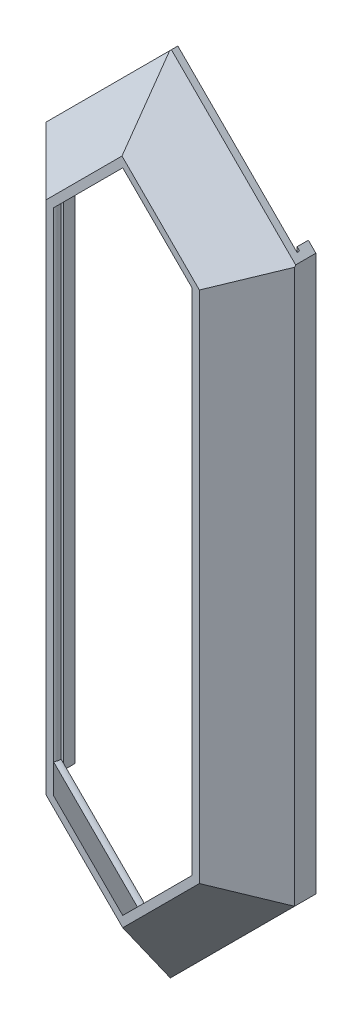
ISO-10303-21;
HEADER;
FILE_DESCRIPTION(('STEP AP214'),'2;1');
FILE_NAME('part.step','',(''),(''),'','','');
FILE_SCHEMA(('AUTOMOTIVE_DESIGN { 1 0 10303 214 1 1 1 1 }'));
ENDSEC;
DATA;
#1=APPLICATION_CONTEXT('core data for automotive mechanical design processes');
#2=APPLICATION_PROTOCOL_DEFINITION('international standard','automotive_design',2000,#1);
#3=PRODUCT_CONTEXT('',#1,'mechanical');
#4=PRODUCT('Part','Part','',(#3));
#5=PRODUCT_RELATED_PRODUCT_CATEGORY('part','',(#4));
#6=PRODUCT_DEFINITION_FORMATION('','',#4);
#7=PRODUCT_DEFINITION_CONTEXT('part definition',#1,'design');
#8=PRODUCT_DEFINITION('design','',#6,#7);
#9=PRODUCT_DEFINITION_SHAPE('','',#8);
#10=(LENGTH_UNIT() NAMED_UNIT(*) SI_UNIT(.MILLI.,.METRE.));
#11=(NAMED_UNIT(*) PLANE_ANGLE_UNIT() SI_UNIT($,.RADIAN.));
#12=(NAMED_UNIT(*) SI_UNIT($,.STERADIAN.) SOLID_ANGLE_UNIT());
#13=UNCERTAINTY_MEASURE_WITH_UNIT(LENGTH_MEASURE(1.E-05),#10,'distance_accuracy_value','');
#14=(GEOMETRIC_REPRESENTATION_CONTEXT(3) GLOBAL_UNCERTAINTY_ASSIGNED_CONTEXT((#13)) GLOBAL_UNIT_ASSIGNED_CONTEXT((#10,
#11,#12)) REPRESENTATION_CONTEXT('',''));
#15=CARTESIAN_POINT('',(0.,0.,0.));
#16=DIRECTION('',(0.,0.,1.));
#17=DIRECTION('',(1.,0.,0.));
#18=AXIS2_PLACEMENT_3D('',#15,#16,#17);
#19=CARTESIAN_POINT('',(0.,0.,-3.));
#20=DIRECTION('',(0.,0.,-1.));
#21=DIRECTION('',(-1.,0.,0.));
#22=AXIS2_PLACEMENT_3D('',#19,#20,#21);
#23=PLANE('',#22);
#24=DIRECTION('',(0.,1.,0.));
#25=VECTOR('',#24,1.);
#26=CARTESIAN_POINT('',(-18.6343452122827,0.,-3.));
#27=LINE('',#26,#25);
#28=CARTESIAN_POINT('',(-18.6343452122827,-45.7,-3.));
#29=VERTEX_POINT('',#28);
#30=CARTESIAN_POINT('',(-18.6343452122827,45.3,-3.));
#31=VERTEX_POINT('',#30);
#32=EDGE_CURVE('E258',#29,#31,#27,.T.);
#33=ORIENTED_EDGE('',*,*,#32,.F.);
#34=DIRECTION('',(-0.707106781186548,0.707106781186547,0.));
#35=VECTOR('',#34,1.);
#36=CARTESIAN_POINT('',(-19.8343452122827,-44.5,-3.));
#37=LINE('',#36,#35);
#38=CARTESIAN_POINT('',(-19.8343452122827,-44.5,-3.));
#39=VERTEX_POINT('',#38);
#40=EDGE_CURVE('E257',#29,#39,#37,.T.);
#41=ORIENTED_EDGE('',*,*,#40,.T.);
#42=DIRECTION('',(0.,1.,0.));
#43=VECTOR('',#42,1.);
#44=CARTESIAN_POINT('',(-19.8343452122827,44.1,-3.));
#45=LINE('',#44,#43);
#46=CARTESIAN_POINT('',(-19.8343452122827,44.1,-3.));
#47=VERTEX_POINT('',#46);
#48=EDGE_CURVE('E278',#39,#47,#45,.T.);
#49=ORIENTED_EDGE('',*,*,#48,.T.);
#50=DIRECTION('',(0.707106781186548,0.707106781186547,0.));
#51=VECTOR('',#50,1.);
#52=CARTESIAN_POINT('',(0.,63.9343452122827,-3.));
#53=LINE('',#52,#51);
#54=EDGE_CURVE('E274',#47,#31,#53,.T.);
#55=ORIENTED_EDGE('',*,*,#54,.T.);
#56=EDGE_LOOP('',(#33,#41,#49,#55));
#57=FACE_BOUND('',#56,.T.);
#58=ADVANCED_FACE('F69',(#57),#23,.T.);
#59=CARTESIAN_POINT('',(-19.2656547877174,43.6029437251523,-1.2));
#60=DIRECTION('',(0.,0.,1.));
#61=DIRECTION('',(0.,-1.,0.));
#62=AXIS2_PLACEMENT_3D('',#59,#60,#61);
#63=PLANE('',#62);
#64=DIRECTION('',(0.,-1.,0.));
#65=VECTOR('',#64,1.);
#66=CARTESIAN_POINT('',(-18.6343452122827,0.,-1.19999999999999));
#67=LINE('',#66,#65);
#68=CARTESIAN_POINT('',(-18.6343452122827,45.3,-1.2));
#69=VERTEX_POINT('',#68);
#70=CARTESIAN_POINT('',(-18.6343452122827,-45.7,-1.2));
#71=VERTEX_POINT('',#70);
#72=EDGE_CURVE('E84',#69,#71,#67,.T.);
#73=ORIENTED_EDGE('',*,*,#72,.F.);
#74=DIRECTION('',(-0.707106781186548,-0.707106781186547,0.));
#75=VECTOR('',#74,1.);
#76=CARTESIAN_POINT('',(-19.8343452122827,44.1,-1.2));
#77=LINE('',#76,#75);
#78=CARTESIAN_POINT('',(-19.2656547877173,44.6686904245654,-1.2));
#79=VERTEX_POINT('',#78);
#80=EDGE_CURVE('E527',#69,#79,#77,.T.);
#81=ORIENTED_EDGE('',*,*,#80,.T.);
#82=DIRECTION('',(0.,-1.,0.));
#83=VECTOR('',#82,1.);
#84=CARTESIAN_POINT('',(-19.2656547877174,43.6029437251523,-1.2));
#85=LINE('',#84,#83);
#86=CARTESIAN_POINT('',(-19.2656547877173,-45.0686904245653,-1.19999999999999));
#87=VERTEX_POINT('',#86);
#88=EDGE_CURVE('E541',#79,#87,#85,.T.);
#89=ORIENTED_EDGE('',*,*,#88,.T.);
#90=DIRECTION('',(-0.707106781186548,0.707106781186547,0.));
#91=VECTOR('',#90,1.);
#92=CARTESIAN_POINT('',(0.,-64.3343452122827,-1.19999999999999));
#93=LINE('',#92,#91);
#94=EDGE_CURVE('E510',#71,#87,#93,.T.);
#95=ORIENTED_EDGE('',*,*,#94,.F.);
#96=EDGE_LOOP('',(#73,#81,#89,#95));
#97=FACE_BOUND('',#96,.T.);
#98=ADVANCED_FACE('F594',(#97),#63,.T.);
#99=CARTESIAN_POINT('',(0.,63.9343452122827,8.));
#100=DIRECTION('',(-0.707106781186547,-0.707106781186547,0.));
#101=DIRECTION('',(0.707106781186548,-0.707106781186548,0.));
#102=AXIS2_PLACEMENT_3D('',#99,#100,#101);
#103=PLANE('',#102);
#104=DIRECTION('',(0.707106781186548,-0.707106781186548,0.));
#105=VECTOR('',#104,1.);
#106=CARTESIAN_POINT('',(19.8343452122826,44.1,-3.));
#107=LINE('',#106,#105);
#108=CARTESIAN_POINT('',(18.6343452122826,45.3,-3.));
#109=VERTEX_POINT('',#108);
#110=CARTESIAN_POINT('',(19.8343452122826,44.1,-3.));
#111=VERTEX_POINT('',#110);
#112=EDGE_CURVE('E251',#109,#111,#107,.T.);
#113=ORIENTED_EDGE('',*,*,#112,.F.);
#114=DIRECTION('',(0.,0.,1.));
#115=VECTOR('',#114,1.);
#116=CARTESIAN_POINT('',(18.6343452122826,45.3,8.));
#117=LINE('',#116,#115);
#118=CARTESIAN_POINT('',(18.6343452122826,45.3,-1.2));
#119=VERTEX_POINT('',#118);
#120=EDGE_CURVE('E261',#109,#119,#117,.T.);
#121=ORIENTED_EDGE('',*,*,#120,.T.);
#122=DIRECTION('',(-0.707106781186548,0.707106781186548,0.));
#123=VECTOR('',#122,1.);
#124=CARTESIAN_POINT('',(0.,63.9343452122827,-1.2));
#125=LINE('',#124,#123);
#126=CARTESIAN_POINT('',(19.0343452122826,44.9,-1.2));
#127=VERTEX_POINT('',#126);
#128=EDGE_CURVE('E529',#127,#119,#125,.T.);
#129=ORIENTED_EDGE('',*,*,#128,.F.);
#130=DIRECTION('',(0.,0.,-1.));
#131=VECTOR('',#130,1.);
#132=CARTESIAN_POINT('',(19.0343452122826,44.9,8.));
#133=LINE('',#132,#131);
#134=CARTESIAN_POINT('',(19.0343452122826,44.9,-0.800000000000001));
#135=VERTEX_POINT('',#134);
#136=EDGE_CURVE('E534',#135,#127,#133,.T.);
#137=ORIENTED_EDGE('',*,*,#136,.F.);
#138=DIRECTION('',(-0.707106781186548,0.707106781186548,0.));
#139=VECTOR('',#138,1.);
#140=CARTESIAN_POINT('',(0.,63.9343452122827,-0.800000000000004));
#141=LINE('',#140,#139);
#142=CARTESIAN_POINT('',(0.,63.9343452122827,-0.800000000000003));
#143=VERTEX_POINT('',#142);
#144=EDGE_CURVE('E524',#135,#143,#141,.T.);
#145=ORIENTED_EDGE('',*,*,#144,.T.);
#146=DIRECTION('',(0.,0.,-1.));
#147=VECTOR('',#146,1.);
#148=CARTESIAN_POINT('',(0.,63.9343452122827,8.));
#149=LINE('',#148,#147);
#150=CARTESIAN_POINT('',(0.,63.9343452122827,0.230175068307269));
#151=VERTEX_POINT('',#150);
#152=EDGE_CURVE('E381',#151,#143,#149,.T.);
#153=ORIENTED_EDGE('',*,*,#152,.F.);
#154=DIRECTION('',(0.707106781186547,-0.707106781186547,0.));
#155=VECTOR('',#154,1.);
#156=CARTESIAN_POINT('',(0.,63.9343452122827,0.23017506830727));
#157=LINE('',#156,#155);
#158=CARTESIAN_POINT('',(19.8343452122826,44.1,0.23017506830727));
#159=VERTEX_POINT('',#158);
#160=EDGE_CURVE('E322',#159,#151,#157,.F.);
#161=ORIENTED_EDGE('',*,*,#160,.F.);
#162=DIRECTION('',(0.,0.,-1.));
#163=VECTOR('',#162,1.);
#164=CARTESIAN_POINT('',(19.8343452122826,44.1,8.));
#165=LINE('',#164,#163);
#166=EDGE_CURVE('E271',#159,#111,#165,.T.);
#167=ORIENTED_EDGE('',*,*,#166,.T.);
#168=EDGE_LOOP('',(#113,#121,#129,#137,#145,#153,#161,#167));
#169=FACE_BOUND('',#168,.T.);
#170=ADVANCED_FACE('F268',(#169),#103,.F.);
#171=CARTESIAN_POINT('',(-19.8343452122827,44.1,8.));
#172=DIRECTION('',(0.707106781186547,-0.707106781186548,0.));
#173=DIRECTION('',(0.707106781186548,0.707106781186547,0.));
#174=AXIS2_PLACEMENT_3D('',#171,#172,#173);
#175=PLANE('',#174);
#176=ORIENTED_EDGE('',*,*,#80,.F.);
#177=DIRECTION('',(0.,0.,-1.));
#178=VECTOR('',#177,1.);
#179=CARTESIAN_POINT('',(-18.6343452122827,45.3,8.));
#180=LINE('',#179,#178);
#181=EDGE_CURVE('E512',#69,#31,#180,.T.);
#182=ORIENTED_EDGE('',*,*,#181,.T.);
#183=ORIENTED_EDGE('',*,*,#54,.F.);
#184=DIRECTION('',(0.,0.,-1.));
#185=VECTOR('',#184,1.);
#186=CARTESIAN_POINT('',(-19.8343452122827,44.1,8.));
#187=LINE('',#186,#185);
#188=CARTESIAN_POINT('',(-19.8343452122827,44.1,0.399999999999987));
#189=VERTEX_POINT('',#188);
#190=EDGE_CURVE('E349',#189,#47,#187,.T.);
#191=ORIENTED_EDGE('',*,*,#190,.F.);
#192=DIRECTION('',(0.707106781186548,0.707106781186547,0.));
#193=VECTOR('',#192,1.);
#194=CARTESIAN_POINT('',(-19.8343452122827,44.1,0.399999999999986));
#195=LINE('',#194,#193);
#196=CARTESIAN_POINT('',(-0.120084360814485,63.8142608514682,0.399999999999998));
#197=VERTEX_POINT('',#196);
#198=EDGE_CURVE('E326',#197,#189,#195,.F.);
#199=ORIENTED_EDGE('',*,*,#198,.F.);
#200=DIRECTION('',(0.500000000000001,0.500000000000001,-0.707106781186546));
#201=VECTOR('',#200,1.);
#202=CARTESIAN_POINT('',(-12.6642205550575,51.2701246572252,18.1400875341536));
#203=LINE('',#202,#201);
#204=EDGE_CURVE('E320',#151,#197,#203,.F.);
#205=ORIENTED_EDGE('',*,*,#204,.F.);
#206=ORIENTED_EDGE('',*,*,#152,.T.);
#207=DIRECTION('',(-0.707106781186548,-0.707106781186547,0.));
#208=VECTOR('',#207,1.);
#209=CARTESIAN_POINT('',(-19.8343452122827,44.1,-0.8));
#210=LINE('',#209,#208);
#211=CARTESIAN_POINT('',(-19.2656547877173,44.6686904245654,-0.8));
#212=VERTEX_POINT('',#211);
#213=EDGE_CURVE('E521',#143,#212,#210,.T.);
#214=ORIENTED_EDGE('',*,*,#213,.T.);
#215=DIRECTION('',(0.,0.,1.));
#216=VECTOR('',#215,1.);
#217=CARTESIAN_POINT('',(-19.2656547877173,44.6686904245654,8.));
#218=LINE('',#217,#216);
#219=EDGE_CURVE('E531',#79,#212,#218,.T.);
#220=ORIENTED_EDGE('',*,*,#219,.F.);
#221=EDGE_LOOP('',(#176,#182,#183,#191,#199,#205,#206,#214,#220));
#222=FACE_BOUND('',#221,.T.);
#223=ADVANCED_FACE('F557',(#222),#175,.F.);
#224=CARTESIAN_POINT('',(-18.6343452122827,0.,-3.));
#225=DIRECTION('',(1.,0.,0.));
#226=DIRECTION('',(0.,1.,0.));
#227=AXIS2_PLACEMENT_3D('',#224,#225,#226);
#228=PLANE('',#227);
#229=ORIENTED_EDGE('',*,*,#32,.T.);
#230=ORIENTED_EDGE('',*,*,#181,.F.);
#231=ORIENTED_EDGE('',*,*,#72,.T.);
#232=DIRECTION('',(0.,0.,1.));
#233=VECTOR('',#232,1.);
#234=CARTESIAN_POINT('',(-18.6343452122827,-45.7,8.));
#235=LINE('',#234,#233);
#236=EDGE_CURVE('E265',#29,#71,#235,.T.);
#237=ORIENTED_EDGE('',*,*,#236,.F.);
#238=EDGE_LOOP('',(#229,#230,#231,#237));
#239=FACE_BOUND('',#238,.T.);
#240=ADVANCED_FACE('F629',(#239),#228,.T.);
#241=CARTESIAN_POINT('',(18.6343452122827,0.,-3.));
#242=DIRECTION('',(-1.,0.,0.));
#243=DIRECTION('',(0.,-1.,0.));
#244=AXIS2_PLACEMENT_3D('',#241,#242,#243);
#245=PLANE('',#244);
#246=DIRECTION('',(0.,-1.,0.));
#247=VECTOR('',#246,1.);
#248=CARTESIAN_POINT('',(18.6343452122827,0.,-3.));
#249=LINE('',#248,#247);
#250=CARTESIAN_POINT('',(18.6343452122826,-45.7,-3.));
#251=VERTEX_POINT('',#250);
#252=EDGE_CURVE('E246',#109,#251,#249,.T.);
#253=ORIENTED_EDGE('',*,*,#252,.T.);
#254=DIRECTION('',(0.,0.,-1.));
#255=VECTOR('',#254,1.);
#256=CARTESIAN_POINT('',(18.6343452122826,-45.7,8.));
#257=LINE('',#256,#255);
#258=CARTESIAN_POINT('',(18.6343452122826,-45.7,-1.19999999999999));
#259=VERTEX_POINT('',#258);
#260=EDGE_CURVE('E266',#259,#251,#257,.T.);
#261=ORIENTED_EDGE('',*,*,#260,.F.);
#262=DIRECTION('',(0.,1.,0.));
#263=VECTOR('',#262,1.);
#264=CARTESIAN_POINT('',(18.6343452122827,0.,-1.19999999999999));
#265=LINE('',#264,#263);
#266=EDGE_CURVE('E13',#259,#119,#265,.T.);
#267=ORIENTED_EDGE('',*,*,#266,.T.);
#268=ORIENTED_EDGE('',*,*,#120,.F.);
#269=EDGE_LOOP('',(#253,#261,#267,#268));
#270=FACE_BOUND('',#269,.T.);
#271=ADVANCED_FACE('F262',(#270),#245,.T.);
#272=CARTESIAN_POINT('',(-19.8343452122827,-44.5,8.));
#273=DIRECTION('',(1.,0.,0.));
#274=DIRECTION('',(0.,1.,0.));
#275=AXIS2_PLACEMENT_3D('',#272,#273,#274);
#276=PLANE('',#275);
#277=DIRECTION('',(0.,1.,0.));
#278=VECTOR('',#277,1.);
#279=CARTESIAN_POINT('',(-19.8343452122827,-44.5,0.400000000000028));
#280=LINE('',#279,#278);
#281=CARTESIAN_POINT('',(-19.8343452122827,-44.5,0.399999999999991));
#282=VERTEX_POINT('',#281);
#283=EDGE_CURVE('E328',#189,#282,#280,.F.);
#284=ORIENTED_EDGE('',*,*,#283,.F.);
#285=ORIENTED_EDGE('',*,*,#190,.T.);
#286=ORIENTED_EDGE('',*,*,#48,.F.);
#287=DIRECTION('',(0.,0.,-1.));
#288=VECTOR('',#287,1.);
#289=CARTESIAN_POINT('',(-19.8343452122827,-44.5,8.));
#290=LINE('',#289,#288);
#291=EDGE_CURVE('E390',#282,#39,#290,.T.);
#292=ORIENTED_EDGE('',*,*,#291,.F.);
#293=EDGE_LOOP('',(#284,#285,#286,#292));
#294=FACE_BOUND('',#293,.T.);
#295=ADVANCED_FACE('F637',(#294),#276,.F.);
#296=CARTESIAN_POINT('',(0.,-64.3343452122827,8.));
#297=DIRECTION('',(0.707106781186547,0.707106781186548,0.));
#298=DIRECTION('',(-0.707106781186548,0.707106781186547,0.));
#299=AXIS2_PLACEMENT_3D('',#296,#297,#298);
#300=PLANE('',#299);
#301=ORIENTED_EDGE('',*,*,#40,.F.);
#302=ORIENTED_EDGE('',*,*,#236,.T.);
#303=ORIENTED_EDGE('',*,*,#94,.T.);
#304=DIRECTION('',(0.,0.,-1.));
#305=VECTOR('',#304,1.);
#306=CARTESIAN_POINT('',(-19.2656547877173,-45.0686904245653,8.));
#307=LINE('',#306,#305);
#308=CARTESIAN_POINT('',(-19.2656547877173,-45.0686904245653,-0.799999999999989));
#309=VERTEX_POINT('',#308);
#310=EDGE_CURVE('E505',#309,#87,#307,.T.);
#311=ORIENTED_EDGE('',*,*,#310,.F.);
#312=DIRECTION('',(-0.707106781186548,0.707106781186547,0.));
#313=VECTOR('',#312,1.);
#314=CARTESIAN_POINT('',(0.,-64.3343452122827,-0.799999999999986));
#315=LINE('',#314,#313);
#316=CARTESIAN_POINT('',(0.,-64.3343452122827,-0.799999999999988));
#317=VERTEX_POINT('',#316);
#318=EDGE_CURVE('E503',#317,#309,#315,.T.);
#319=ORIENTED_EDGE('',*,*,#318,.F.);
#320=DIRECTION('',(0.,0.,-1.));
#321=VECTOR('',#320,1.);
#322=CARTESIAN_POINT('',(0.,-64.3343452122827,8.));
#323=LINE('',#322,#321);
#324=CARTESIAN_POINT('',(0.,-64.3343452122827,0.399999999999996));
#325=VERTEX_POINT('',#324);
#326=EDGE_CURVE('E387',#325,#317,#323,.T.);
#327=ORIENTED_EDGE('',*,*,#326,.F.);
#328=DIRECTION('',(-0.707106781186548,0.707106781186547,0.));
#329=VECTOR('',#328,1.);
#330=CARTESIAN_POINT('',(0.,-64.3343452122827,0.399999999999996));
#331=LINE('',#330,#329);
#332=EDGE_CURVE('E306',#282,#325,#331,.F.);
#333=ORIENTED_EDGE('',*,*,#332,.F.);
#334=ORIENTED_EDGE('',*,*,#291,.T.);
#335=EDGE_LOOP('',(#301,#302,#303,#311,#319,#327,#333,#334));
#336=FACE_BOUND('',#335,.T.);
#337=ADVANCED_FACE('F499',(#336),#300,.F.);
#338=CARTESIAN_POINT('',(19.8343452122827,-44.5,8.));
#339=DIRECTION('',(-0.707106781186547,0.707106781186548,0.));
#340=DIRECTION('',(-0.707106781186548,-0.707106781186547,0.));
#341=AXIS2_PLACEMENT_3D('',#338,#339,#340);
#342=PLANE('',#341);
#343=DIRECTION('',(-0.707106781186548,-0.707106781186547,0.));
#344=VECTOR('',#343,1.);
#345=CARTESIAN_POINT('',(19.8343452122827,-44.5,-1.19999999999999));
#346=LINE('',#345,#344);
#347=CARTESIAN_POINT('',(19.0343452122827,-45.3,-1.19999999999999));
#348=VERTEX_POINT('',#347);
#349=EDGE_CURVE('E507',#348,#259,#346,.T.);
#350=ORIENTED_EDGE('',*,*,#349,.T.);
#351=ORIENTED_EDGE('',*,*,#260,.T.);
#352=DIRECTION('',(-0.707106781186548,-0.707106781186547,0.));
#353=VECTOR('',#352,1.);
#354=CARTESIAN_POINT('',(0.,-64.3343452122827,-3.));
#355=LINE('',#354,#353);
#356=CARTESIAN_POINT('',(19.8343452122827,-44.5,-3.));
#357=VERTEX_POINT('',#356);
#358=EDGE_CURVE('E254',#357,#251,#355,.T.);
#359=ORIENTED_EDGE('',*,*,#358,.F.);
#360=DIRECTION('',(0.,0.,-1.));
#361=VECTOR('',#360,1.);
#362=CARTESIAN_POINT('',(19.8343452122827,-44.5,8.));
#363=LINE('',#362,#361);
#364=CARTESIAN_POINT('',(19.8343452122827,-44.5,0.399999999999965));
#365=VERTEX_POINT('',#364);
#366=EDGE_CURVE('E385',#365,#357,#363,.T.);
#367=ORIENTED_EDGE('',*,*,#366,.F.);
#368=DIRECTION('',(-0.707106781186548,-0.707106781186547,0.));
#369=VECTOR('',#368,1.);
#370=CARTESIAN_POINT('',(19.8343452122827,-44.5,0.399999999999992));
#371=LINE('',#370,#369);
#372=EDGE_CURVE('E316',#325,#365,#371,.F.);
#373=ORIENTED_EDGE('',*,*,#372,.F.);
#374=ORIENTED_EDGE('',*,*,#326,.T.);
#375=DIRECTION('',(-0.707106781186548,-0.707106781186547,0.));
#376=VECTOR('',#375,1.);
#377=CARTESIAN_POINT('',(19.8343452122827,-44.5,-0.79999999999999));
#378=LINE('',#377,#376);
#379=CARTESIAN_POINT('',(19.0343452122827,-45.3,-0.79999999999999));
#380=VERTEX_POINT('',#379);
#381=EDGE_CURVE('E508',#380,#317,#378,.T.);
#382=ORIENTED_EDGE('',*,*,#381,.F.);
#383=DIRECTION('',(0.,0.,1.));
#384=VECTOR('',#383,1.);
#385=CARTESIAN_POINT('',(19.0343452122827,-45.3,8.));
#386=LINE('',#385,#384);
#387=EDGE_CURVE('E518',#348,#380,#386,.T.);
#388=ORIENTED_EDGE('',*,*,#387,.F.);
#389=EDGE_LOOP('',(#350,#351,#359,#367,#373,#374,#382,#388));
#390=FACE_BOUND('',#389,.T.);
#391=ADVANCED_FACE('F494',(#390),#342,.F.);
#392=CARTESIAN_POINT('',(19.8343452122826,44.1,8.));
#393=DIRECTION('',(-1.,0.,0.));
#394=DIRECTION('',(0.,-1.,0.));
#395=AXIS2_PLACEMENT_3D('',#392,#393,#394);
#396=PLANE('',#395);
#397=DIRECTION('',(0.,-0.816496580927727,0.577350269189624));
#398=VECTOR('',#397,1.);
#399=CARTESIAN_POINT('',(19.8343452122826,40.4372694014452,2.82011671220483));
#400=LINE('',#399,#398);
#401=CARTESIAN_POINT('',(19.8343452122826,43.859831278371,0.400000000000028));
#402=VERTEX_POINT('',#401);
#403=EDGE_CURVE('E324',#402,#159,#400,.F.);
#404=ORIENTED_EDGE('',*,*,#403,.F.);
#405=DIRECTION('',(0.,-1.,0.));
#406=VECTOR('',#405,1.);
#407=CARTESIAN_POINT('',(19.8343452122826,44.1,0.400000000000028));
#408=LINE('',#407,#406);
#409=EDGE_CURVE('E318',#365,#402,#408,.F.);
#410=ORIENTED_EDGE('',*,*,#409,.F.);
#411=ORIENTED_EDGE('',*,*,#366,.T.);
#412=DIRECTION('',(0.,-1.,0.));
#413=VECTOR('',#412,1.);
#414=CARTESIAN_POINT('',(19.8343452122827,-44.5,-3.));
#415=LINE('',#414,#413);
#416=EDGE_CURVE('E273',#111,#357,#415,.T.);
#417=ORIENTED_EDGE('',*,*,#416,.F.);
#418=ORIENTED_EDGE('',*,*,#166,.F.);
#419=EDGE_LOOP('',(#404,#410,#411,#417,#418));
#420=FACE_BOUND('',#419,.T.);
#421=ADVANCED_FACE('F472',(#420),#396,.F.);
#422=CARTESIAN_POINT('',(0.,0.,8.));
#423=DIRECTION('',(0.,0.,-1.));
#424=DIRECTION('',(-1.,0.,0.));
#425=AXIS2_PLACEMENT_3D('',#422,#423,#424);
#426=PLANE('',#425);
#427=DIRECTION('',(0.707106781186548,0.707106781186547,0.));
#428=VECTOR('',#427,1.);
#429=CARTESIAN_POINT('',(5.65685424949238,57.1461201128918,8.));
#430=LINE('',#429,#428);
#431=CARTESIAN_POINT('',(-11.0343452122827,40.4549206511167,8.));
#432=VERTEX_POINT('',#431);
#433=CARTESIAN_POINT('',(0.,51.4892658633994,8.));
#434=VERTEX_POINT('',#433);
#435=EDGE_CURVE('E355',#432,#434,#430,.T.);
#436=ORIENTED_EDGE('',*,*,#435,.T.);
#437=DIRECTION('',(0.707106781186547,-0.707106781186547,0.));
#438=VECTOR('',#437,1.);
#439=CARTESIAN_POINT('',(13.3774909627903,38.1117749006091,8.));
#440=LINE('',#439,#438);
#441=CARTESIAN_POINT('',(11.0343452122826,40.4549206511167,8.));
#442=VERTEX_POINT('',#441);
#443=EDGE_CURVE('E345',#434,#442,#440,.T.);
#444=ORIENTED_EDGE('',*,*,#443,.T.);
#445=DIRECTION('',(0.,-1.,0.));
#446=VECTOR('',#445,1.);
#447=CARTESIAN_POINT('',(11.0343452122826,-44.1686291501015,8.));
#448=LINE('',#447,#446);
#449=CARTESIAN_POINT('',(11.0343452122826,-40.8549206511167,8.));
#450=VERTEX_POINT('',#449);
#451=EDGE_CURVE('E366',#442,#450,#448,.T.);
#452=ORIENTED_EDGE('',*,*,#451,.T.);
#453=DIRECTION('',(-0.707106781186548,-0.707106781186548,0.));
#454=VECTOR('',#453,1.);
#455=CARTESIAN_POINT('',(-5.6568542494924,-57.5461201128918,8.));
#456=LINE('',#455,#454);
#457=CARTESIAN_POINT('',(0.,-51.8892658633994,8.));
#458=VERTEX_POINT('',#457);
#459=EDGE_CURVE('E375',#450,#458,#456,.T.);
#460=ORIENTED_EDGE('',*,*,#459,.T.);
#461=DIRECTION('',(-0.707106781186548,0.707106781186547,0.));
#462=VECTOR('',#461,1.);
#463=CARTESIAN_POINT('',(-13.3774909627903,-38.5117749006091,8.));
#464=LINE('',#463,#462);
#465=CARTESIAN_POINT('',(-11.0343452122827,-40.8549206511167,8.));
#466=VERTEX_POINT('',#465);
#467=EDGE_CURVE('E372',#458,#466,#464,.T.);
#468=ORIENTED_EDGE('',*,*,#467,.T.);
#469=DIRECTION('',(0.,1.,0.));
#470=VECTOR('',#469,1.);
#471=CARTESIAN_POINT('',(-11.0343452122827,43.7686291501015,8.));
#472=LINE('',#471,#470);
#473=EDGE_CURVE('E369',#466,#432,#472,.T.);
#474=ORIENTED_EDGE('',*,*,#473,.T.);
#475=EDGE_LOOP('',(#436,#444,#452,#460,#468,#474));
#476=FACE_BOUND('',#475,.T.);
#477=DIRECTION('',(0.,-1.,0.));
#478=VECTOR('',#477,1.);
#479=CARTESIAN_POINT('',(-12.2343452122827,-41.3519769259644,8.));
#480=LINE('',#479,#478);
#481=CARTESIAN_POINT('',(-12.2343452122827,40.9519769259645,8.));
#482=VERTEX_POINT('',#481);
#483=CARTESIAN_POINT('',(-12.2343452122827,-41.3519769259644,8.));
#484=VERTEX_POINT('',#483);
#485=EDGE_CURVE('E283',#482,#484,#480,.T.);
#486=ORIENTED_EDGE('',*,*,#485,.T.);
#487=DIRECTION('',(0.707106781186548,-0.707106781186548,0.));
#488=VECTOR('',#487,1.);
#489=CARTESIAN_POINT('',(0.,-53.5863221382471,8.));
#490=LINE('',#489,#488);
#491=CARTESIAN_POINT('',(0.,-53.5863221382471,8.));
#492=VERTEX_POINT('',#491);
#493=EDGE_CURVE('E286',#484,#492,#490,.T.);
#494=ORIENTED_EDGE('',*,*,#493,.T.);
#495=DIRECTION('',(0.707106781186548,0.707106781186547,0.));
#496=VECTOR('',#495,1.);
#497=CARTESIAN_POINT('',(12.2343452122826,-41.3519769259645,8.));
#498=LINE('',#497,#496);
#499=CARTESIAN_POINT('',(12.2343452122826,-41.3519769259645,8.));
#500=VERTEX_POINT('',#499);
#501=EDGE_CURVE('E289',#492,#500,#498,.T.);
#502=ORIENTED_EDGE('',*,*,#501,.T.);
#503=DIRECTION('',(0.,1.,0.));
#504=VECTOR('',#503,1.);
#505=CARTESIAN_POINT('',(12.2343452122826,40.7118082043355,8.));
#506=LINE('',#505,#504);
#507=CARTESIAN_POINT('',(12.2343452122826,40.7118082043355,8.));
#508=VERTEX_POINT('',#507);
#509=EDGE_CURVE('E292',#500,#508,#506,.T.);
#510=ORIENTED_EDGE('',*,*,#509,.T.);
#511=DIRECTION('',(-0.707106781186548,0.707106781186548,0.));
#512=VECTOR('',#511,1.);
#513=CARTESIAN_POINT('',(-0.120084360814488,53.0662377774326,8.));
#514=LINE('',#513,#512);
#515=CARTESIAN_POINT('',(-0.120084360814488,53.0662377774326,8.));
#516=VERTEX_POINT('',#515);
#517=EDGE_CURVE('E295',#508,#516,#514,.T.);
#518=ORIENTED_EDGE('',*,*,#517,.T.);
#519=DIRECTION('',(-0.707106781186548,-0.707106781186547,0.));
#520=VECTOR('',#519,1.);
#521=CARTESIAN_POINT('',(-12.2343452122827,40.9519769259645,8.));
#522=LINE('',#521,#520);
#523=EDGE_CURVE('E298',#516,#482,#522,.T.);
#524=ORIENTED_EDGE('',*,*,#523,.T.);
#525=EDGE_LOOP('',(#486,#494,#502,#510,#518,#524));
#526=FACE_BOUND('',#525,.T.);
#527=ADVANCED_FACE('F469',(#476,#526),#426,.F.);
#528=CARTESIAN_POINT('',(19.0343452122827,43.7686291501015,0.));
#529=DIRECTION('',(0.499999999999999,0.499999999999999,0.707106781186549));
#530=DIRECTION('',(0.816496580927727,0.,-0.577350269189624));
#531=AXIS2_PLACEMENT_3D('',#528,#529,#530);
#532=PLANE('',#531);
#533=DIRECTION('',(0.707106781186547,-0.707106781186547,0.));
#534=VECTOR('',#533,1.);
#535=CARTESIAN_POINT('',(19.0343452122827,43.7686291501015,0.));
#536=LINE('',#535,#534);
#537=CARTESIAN_POINT('',(0.,62.8029743623842,0.));
#538=VERTEX_POINT('',#537);
#539=CARTESIAN_POINT('',(19.0343452122827,43.7686291501015,0.));
#540=VERTEX_POINT('',#539);
#541=EDGE_CURVE('E330',#538,#540,#536,.T.);
#542=ORIENTED_EDGE('',*,*,#541,.T.);
#543=DIRECTION('',(0.678598344545848,0.281084637714821,-0.678598344545846));
#544=VECTOR('',#543,1.);
#545=CARTESIAN_POINT('',(19.0343452122827,43.7686291501015,0.));
#546=LINE('',#545,#544);
#547=EDGE_CURVE('E351',#442,#540,#546,.T.);
#548=ORIENTED_EDGE('',*,*,#547,.F.);
#549=ORIENTED_EDGE('',*,*,#443,.F.);
#550=DIRECTION('',(0.,0.816496580927727,-0.577350269189625));
#551=VECTOR('',#550,1.);
#552=CARTESIAN_POINT('',(0.,62.8029743623842,0.));
#553=LINE('',#552,#551);
#554=EDGE_CURVE('E346',#434,#538,#553,.T.);
#555=ORIENTED_EDGE('',*,*,#554,.T.);
#556=EDGE_LOOP('',(#542,#548,#549,#555));
#557=FACE_BOUND('',#556,.T.);
#558=ADVANCED_FACE('F462',(#557),#532,.F.);
#559=CARTESIAN_POINT('',(0.,62.8029743623842,0.));
#560=DIRECTION('',(-0.499999999999999,0.499999999999999,0.707106781186549));
#561=DIRECTION('',(0.,-0.816496580927727,0.577350269189625));
#562=AXIS2_PLACEMENT_3D('',#559,#560,#561);
#563=PLANE('',#562);
#564=DIRECTION('',(0.707106781186548,0.707106781186547,0.));
#565=VECTOR('',#564,1.);
#566=CARTESIAN_POINT('',(0.,62.8029743623842,0.));
#567=LINE('',#566,#565);
#568=CARTESIAN_POINT('',(-19.0343452122827,43.7686291501015,0.));
#569=VERTEX_POINT('',#568);
#570=EDGE_CURVE('E343',#569,#538,#567,.T.);
#571=ORIENTED_EDGE('',*,*,#570,.T.);
#572=ORIENTED_EDGE('',*,*,#554,.F.);
#573=ORIENTED_EDGE('',*,*,#435,.F.);
#574=DIRECTION('',(-0.678598344545848,0.281084637714821,-0.678598344545846));
#575=VECTOR('',#574,1.);
#576=CARTESIAN_POINT('',(-19.0343452122827,43.7686291501015,0.));
#577=LINE('',#576,#575);
#578=EDGE_CURVE('E350',#432,#569,#577,.T.);
#579=ORIENTED_EDGE('',*,*,#578,.T.);
#580=EDGE_LOOP('',(#571,#572,#573,#579));
#581=FACE_BOUND('',#580,.T.);
#582=ADVANCED_FACE('F465',(#581),#563,.F.);
#583=CARTESIAN_POINT('',(-19.0343452122827,43.7686291501015,0.));
#584=DIRECTION('',(-0.707106781186546,0.,0.707106781186549));
#585=DIRECTION('',(0.707106781186549,0.,0.707106781186546));
#586=AXIS2_PLACEMENT_3D('',#583,#584,#585);
#587=PLANE('',#586);
#588=DIRECTION('',(-0.678598344545848,-0.281084637714821,-0.678598344545846));
#589=VECTOR('',#588,1.);
#590=CARTESIAN_POINT('',(-19.0343452122827,-44.1686291501015,0.));
#591=LINE('',#590,#589);
#592=CARTESIAN_POINT('',(-19.0343452122827,-44.1686291501015,0.));
#593=VERTEX_POINT('',#592);
#594=EDGE_CURVE('E359',#466,#593,#591,.T.);
#595=ORIENTED_EDGE('',*,*,#594,.T.);
#596=DIRECTION('',(0.,1.,0.));
#597=VECTOR('',#596,1.);
#598=CARTESIAN_POINT('',(-19.0343452122827,43.7686291501015,0.));
#599=LINE('',#598,#597);
#600=EDGE_CURVE('E341',#593,#569,#599,.T.);
#601=ORIENTED_EDGE('',*,*,#600,.T.);
#602=ORIENTED_EDGE('',*,*,#578,.F.);
#603=ORIENTED_EDGE('',*,*,#473,.F.);
#604=EDGE_LOOP('',(#595,#601,#602,#603));
#605=FACE_BOUND('',#604,.T.);
#606=ADVANCED_FACE('F467',(#605),#587,.F.);
#607=CARTESIAN_POINT('',(-19.0343452122827,-44.1686291501015,0.));
#608=DIRECTION('',(-0.499999999999999,-0.499999999999999,0.707106781186549));
#609=DIRECTION('',(0.,-0.816496580927727,-0.577350269189625));
#610=AXIS2_PLACEMENT_3D('',#607,#608,#609);
#611=PLANE('',#610);
#612=DIRECTION('',(-0.707106781186548,0.707106781186547,0.));
#613=VECTOR('',#612,1.);
#614=CARTESIAN_POINT('',(-19.0343452122827,-44.1686291501015,0.));
#615=LINE('',#614,#613);
#616=CARTESIAN_POINT('',(0.,-63.2029743623842,0.));
#617=VERTEX_POINT('',#616);
#618=EDGE_CURVE('E338',#617,#593,#615,.T.);
#619=ORIENTED_EDGE('',*,*,#618,.T.);
#620=ORIENTED_EDGE('',*,*,#594,.F.);
#621=ORIENTED_EDGE('',*,*,#467,.F.);
#622=DIRECTION('',(0.,-0.816496580927727,-0.577350269189625));
#623=VECTOR('',#622,1.);
#624=CARTESIAN_POINT('',(0.,-63.2029743623842,0.));
#625=LINE('',#624,#623);
#626=EDGE_CURVE('E357',#458,#617,#625,.T.);
#627=ORIENTED_EDGE('',*,*,#626,.T.);
#628=EDGE_LOOP('',(#619,#620,#621,#627));
#629=FACE_BOUND('',#628,.T.);
#630=ADVANCED_FACE('F451',(#629),#611,.F.);
#631=CARTESIAN_POINT('',(0.,-63.2029743623842,0.));
#632=DIRECTION('',(0.499999999999999,-0.499999999999999,0.707106781186549));
#633=DIRECTION('',(0.816496580927727,0.,-0.577350269189624));
#634=AXIS2_PLACEMENT_3D('',#631,#632,#633);
#635=PLANE('',#634);
#636=DIRECTION('',(-0.707106781186548,-0.707106781186548,0.));
#637=VECTOR('',#636,1.);
#638=CARTESIAN_POINT('',(0.,-63.2029743623842,0.));
#639=LINE('',#638,#637);
#640=CARTESIAN_POINT('',(19.0343452122827,-44.1686291501015,0.));
#641=VERTEX_POINT('',#640);
#642=EDGE_CURVE('E335',#641,#617,#639,.T.);
#643=ORIENTED_EDGE('',*,*,#642,.T.);
#644=ORIENTED_EDGE('',*,*,#626,.F.);
#645=ORIENTED_EDGE('',*,*,#459,.F.);
#646=DIRECTION('',(0.678598344545848,-0.281084637714821,-0.678598344545846));
#647=VECTOR('',#646,1.);
#648=CARTESIAN_POINT('',(19.0343452122827,-44.1686291501015,0.));
#649=LINE('',#648,#647);
#650=EDGE_CURVE('E354',#450,#641,#649,.T.);
#651=ORIENTED_EDGE('',*,*,#650,.T.);
#652=EDGE_LOOP('',(#643,#644,#645,#651));
#653=FACE_BOUND('',#652,.T.);
#654=ADVANCED_FACE('F455',(#653),#635,.F.);
#655=CARTESIAN_POINT('',(19.0343452122827,-44.1686291501015,0.));
#656=DIRECTION('',(0.707106781186546,0.,0.707106781186549));
#657=DIRECTION('',(0.707106781186549,0.,-0.707106781186546));
#658=AXIS2_PLACEMENT_3D('',#655,#656,#657);
#659=PLANE('',#658);
#660=DIRECTION('',(0.,-1.,0.));
#661=VECTOR('',#660,1.);
#662=CARTESIAN_POINT('',(19.0343452122827,-44.1686291501015,0.));
#663=LINE('',#662,#661);
#664=EDGE_CURVE('E332',#540,#641,#663,.T.);
#665=ORIENTED_EDGE('',*,*,#664,.T.);
#666=ORIENTED_EDGE('',*,*,#650,.F.);
#667=ORIENTED_EDGE('',*,*,#451,.F.);
#668=ORIENTED_EDGE('',*,*,#547,.T.);
#669=EDGE_LOOP('',(#665,#666,#667,#668));
#670=FACE_BOUND('',#669,.T.);
#671=ADVANCED_FACE('F459',(#670),#659,.F.);
#672=CARTESIAN_POINT('',(-12.2343452122827,-41.3519769259644,8.));
#673=DIRECTION('',(0.707106781186546,0.,-0.707106781186549));
#674=DIRECTION('',(-0.707106781186549,0.,-0.707106781186546));
#675=AXIS2_PLACEMENT_3D('',#672,#673,#674);
#676=PLANE('',#675);
#677=ORIENTED_EDGE('',*,*,#283,.T.);
#678=DIRECTION('',(0.678598344545848,0.281084637714821,0.678598344545846));
#679=VECTOR('',#678,1.);
#680=CARTESIAN_POINT('',(-12.2343452122827,-41.3519769259644,8.));
#681=LINE('',#680,#679);
#682=EDGE_CURVE('E301',#282,#484,#681,.T.);
#683=ORIENTED_EDGE('',*,*,#682,.T.);
#684=ORIENTED_EDGE('',*,*,#485,.F.);
#685=DIRECTION('',(0.678598344545848,-0.281084637714821,0.678598344545846));
#686=VECTOR('',#685,1.);
#687=CARTESIAN_POINT('',(-12.2343452122827,40.9519769259645,8.));
#688=LINE('',#687,#686);
#689=EDGE_CURVE('E304',#189,#482,#688,.T.);
#690=ORIENTED_EDGE('',*,*,#689,.F.);
#691=EDGE_LOOP('',(#677,#683,#684,#690));
#692=FACE_BOUND('',#691,.T.);
#693=ADVANCED_FACE('F479',(#692),#676,.F.);
#694=CARTESIAN_POINT('',(-12.2343452122827,40.9519769259645,8.));
#695=DIRECTION('',(0.499999999999999,-0.499999999999999,-0.707106781186549));
#696=DIRECTION('',(0.,0.816496580927727,-0.577350269189625));
#697=AXIS2_PLACEMENT_3D('',#694,#695,#696);
#698=PLANE('',#697);
#699=ORIENTED_EDGE('',*,*,#198,.T.);
#700=ORIENTED_EDGE('',*,*,#689,.T.);
#701=ORIENTED_EDGE('',*,*,#523,.F.);
#702=DIRECTION('',(0.,-0.816496580927727,0.577350269189625));
#703=VECTOR('',#702,1.);
#704=CARTESIAN_POINT('',(-0.120084360814487,53.0662377774326,8.));
#705=LINE('',#704,#703);
#706=EDGE_CURVE('E307',#197,#516,#705,.T.);
#707=ORIENTED_EDGE('',*,*,#706,.F.);
#708=EDGE_LOOP('',(#699,#700,#701,#707));
#709=FACE_BOUND('',#708,.T.);
#710=ADVANCED_FACE('F577',(#709),#698,.F.);
#711=CARTESIAN_POINT('',(-0.120084360814488,53.0662377774326,8.));
#712=DIRECTION('',(-0.499999999999999,-0.499999999999999,-0.707106781186549));
#713=DIRECTION('',(-0.816496580927727,0.,0.577350269189624));
#714=AXIS2_PLACEMENT_3D('',#711,#712,#713);
#715=PLANE('',#714);
#716=ORIENTED_EDGE('',*,*,#403,.T.);
#717=ORIENTED_EDGE('',*,*,#160,.T.);
#718=ORIENTED_EDGE('',*,*,#204,.T.);
#719=ORIENTED_EDGE('',*,*,#706,.T.);
#720=ORIENTED_EDGE('',*,*,#517,.F.);
#721=DIRECTION('',(-0.678598344545848,-0.281084637714821,0.678598344545846));
#722=VECTOR('',#721,1.);
#723=CARTESIAN_POINT('',(12.2343452122826,40.7118082043355,8.));
#724=LINE('',#723,#722);
#725=EDGE_CURVE('E309',#402,#508,#724,.T.);
#726=ORIENTED_EDGE('',*,*,#725,.F.);
#727=EDGE_LOOP('',(#716,#717,#718,#719,#720,#726));
#728=FACE_BOUND('',#727,.T.);
#729=ADVANCED_FACE('F574',(#728),#715,.F.);
#730=CARTESIAN_POINT('',(12.2343452122826,40.7118082043355,8.));
#731=DIRECTION('',(-0.707106781186546,0.,-0.707106781186549));
#732=DIRECTION('',(-0.707106781186549,0.,0.707106781186546));
#733=AXIS2_PLACEMENT_3D('',#730,#731,#732);
#734=PLANE('',#733);
#735=ORIENTED_EDGE('',*,*,#409,.T.);
#736=ORIENTED_EDGE('',*,*,#725,.T.);
#737=ORIENTED_EDGE('',*,*,#509,.F.);
#738=DIRECTION('',(-0.678598344545848,0.281084637714821,0.678598344545846));
#739=VECTOR('',#738,1.);
#740=CARTESIAN_POINT('',(12.2343452122826,-41.3519769259645,8.));
#741=LINE('',#740,#739);
#742=EDGE_CURVE('E311',#365,#500,#741,.T.);
#743=ORIENTED_EDGE('',*,*,#742,.F.);
#744=EDGE_LOOP('',(#735,#736,#737,#743));
#745=FACE_BOUND('',#744,.T.);
#746=ADVANCED_FACE('F584',(#745),#734,.F.);
#747=CARTESIAN_POINT('',(12.2343452122826,-41.3519769259645,8.));
#748=DIRECTION('',(-0.499999999999999,0.499999999999999,-0.707106781186549));
#749=DIRECTION('',(0.,0.816496580927727,0.577350269189625));
#750=AXIS2_PLACEMENT_3D('',#747,#748,#749);
#751=PLANE('',#750);
#752=ORIENTED_EDGE('',*,*,#372,.T.);
#753=ORIENTED_EDGE('',*,*,#742,.T.);
#754=ORIENTED_EDGE('',*,*,#501,.F.);
#755=DIRECTION('',(0.,0.816496580927727,0.577350269189625));
#756=VECTOR('',#755,1.);
#757=CARTESIAN_POINT('',(0.,-53.5863221382471,8.));
#758=LINE('',#757,#756);
#759=EDGE_CURVE('E303',#325,#492,#758,.T.);
#760=ORIENTED_EDGE('',*,*,#759,.F.);
#761=EDGE_LOOP('',(#752,#753,#754,#760));
#762=FACE_BOUND('',#761,.T.);
#763=ADVANCED_FACE('F488',(#762),#751,.F.);
#764=CARTESIAN_POINT('',(0.,-53.5863221382471,8.));
#765=DIRECTION('',(0.499999999999999,0.499999999999999,-0.707106781186549));
#766=DIRECTION('',(-0.816496580927727,0.,-0.577350269189624));
#767=AXIS2_PLACEMENT_3D('',#764,#765,#766);
#768=PLANE('',#767);
#769=ORIENTED_EDGE('',*,*,#332,.T.);
#770=ORIENTED_EDGE('',*,*,#759,.T.);
#771=ORIENTED_EDGE('',*,*,#493,.F.);
#772=ORIENTED_EDGE('',*,*,#682,.F.);
#773=EDGE_LOOP('',(#769,#770,#771,#772));
#774=FACE_BOUND('',#773,.T.);
#775=ADVANCED_FACE('F484',(#774),#768,.F.);
#776=ORIENTED_EDGE('',*,*,#252,.F.);
#777=ORIENTED_EDGE('',*,*,#112,.T.);
#778=ORIENTED_EDGE('',*,*,#416,.T.);
#779=ORIENTED_EDGE('',*,*,#358,.T.);
#780=EDGE_LOOP('',(#776,#777,#778,#779));
#781=FACE_BOUND('',#780,.T.);
#782=ADVANCED_FACE('F248',(#781),#23,.T.);
#783=CARTESIAN_POINT('',(-19.6343452122827,0.,-0.800000000000013));
#784=DIRECTION('',(0.,1.,0.));
#785=DIRECTION('',(-1.,0.,0.));
#786=AXIS2_PLACEMENT_3D('',#783,#784,#785);
#787=CYLINDRICAL_SURFACE('',#786,1.);
#788=ORIENTED_EDGE('',*,*,#600,.F.);
#789=CARTESIAN_POINT('',(-19.6343452122827,-44.4171572875254,-0.800000000000004));
#790=DIRECTION('',(-0.38268343236509,0.923879532511287,0.));
#791=DIRECTION('',(-0.923879532511287,-0.38268343236509,0.));
#792=AXIS2_PLACEMENT_3D('',#789,#790,#791);
#793=ELLIPSE('',#792,1.08239220029239,1.);
#794=CARTESIAN_POINT('',(-18.6343452122826,-44.0029437251523,-0.799999999999989));
#795=VERTEX_POINT('',#794);
#796=EDGE_CURVE('E409',#593,#795,#793,.T.);
#797=ORIENTED_EDGE('',*,*,#796,.T.);
#798=DIRECTION('',(0.,-1.,0.));
#799=VECTOR('',#798,1.);
#800=CARTESIAN_POINT('',(-18.6343452122827,-44.0029437251523,-0.800000000000013));
#801=LINE('',#800,#799);
#802=CARTESIAN_POINT('',(-18.6343452122827,43.6029437251523,-0.8));
#803=VERTEX_POINT('',#802);
#804=EDGE_CURVE('E395',#803,#795,#801,.T.);
#805=ORIENTED_EDGE('',*,*,#804,.F.);
#806=CARTESIAN_POINT('',(-19.6343452122827,44.0171572875254,-0.799999999999997));
#807=DIRECTION('',(0.38268343236509,0.923879532511287,0.));
#808=DIRECTION('',(-0.923879532511287,0.38268343236509,0.));
#809=AXIS2_PLACEMENT_3D('',#806,#807,#808);
#810=ELLIPSE('',#809,1.08239220029239,1.);
#811=EDGE_CURVE('E398',#569,#803,#810,.T.);
#812=ORIENTED_EDGE('',*,*,#811,.F.);
#813=EDGE_LOOP('',(#788,#797,#805,#812));
#814=FACE_BOUND('',#813,.T.);
#815=ADVANCED_FACE('F439',(#814),#787,.T.);
#816=CARTESIAN_POINT('',(-31.825751249904,31.8257512499041,-0.799999999999981));
#817=DIRECTION('',(0.707106781186548,0.707106781186547,0.));
#818=DIRECTION('',(-0.707106781186547,0.707106781186548,0.));
#819=AXIS2_PLACEMENT_3D('',#816,#817,#818);
#820=CYLINDRICAL_SURFACE('',#819,1.);
#821=ORIENTED_EDGE('',*,*,#811,.T.);
#822=DIRECTION('',(-0.707106781186548,-0.707106781186547,0.));
#823=VECTOR('',#822,1.);
#824=CARTESIAN_POINT('',(-18.6343452122827,43.6029437251523,-0.799999999999981));
#825=LINE('',#824,#823);
#826=CARTESIAN_POINT('',(0.,62.2372889374349,-0.799999999999999));
#827=VERTEX_POINT('',#826);
#828=EDGE_CURVE('E393',#827,#803,#825,.T.);
#829=ORIENTED_EDGE('',*,*,#828,.F.);
#830=CARTESIAN_POINT('',(0.,63.6515024998081,-0.799999999999992));
#831=DIRECTION('',(1.,0.,0.));
#832=DIRECTION('',(0.,-1.,0.));
#833=AXIS2_PLACEMENT_3D('',#830,#831,#832);
#834=ELLIPSE('',#833,1.41421356237309,1.);
#835=EDGE_CURVE('E77',#827,#538,#834,.F.);
#836=ORIENTED_EDGE('',*,*,#835,.T.);
#837=ORIENTED_EDGE('',*,*,#570,.F.);
#838=EDGE_LOOP('',(#821,#829,#836,#837));
#839=FACE_BOUND('',#838,.T.);
#840=ADVANCED_FACE('F435',(#839),#820,.T.);
#841=CARTESIAN_POINT('',(31.825751249904,31.825751249904,-0.800000000000003));
#842=DIRECTION('',(0.707106781186547,-0.707106781186547,0.));
#843=DIRECTION('',(0.707106781186548,0.707106781186548,0.));
#844=AXIS2_PLACEMENT_3D('',#841,#842,#843);
#845=CYLINDRICAL_SURFACE('',#844,1.);
#846=ORIENTED_EDGE('',*,*,#835,.F.);
#847=DIRECTION('',(-0.707106781186548,0.707106781186548,0.));
#848=VECTOR('',#847,1.);
#849=CARTESIAN_POINT('',(-0.282842712474629,62.5201316499096,-0.800000000000003));
#850=LINE('',#849,#848);
#851=CARTESIAN_POINT('',(18.6343452122826,43.6029437251523,-0.8));
#852=VERTEX_POINT('',#851);
#853=EDGE_CURVE('E407',#852,#827,#850,.T.);
#854=ORIENTED_EDGE('',*,*,#853,.F.);
#855=CARTESIAN_POINT('',(19.6343452122827,44.0171572875254,-0.800000000000007));
#856=DIRECTION('',(0.38268343236509,-0.923879532511287,0.));
#857=DIRECTION('',(0.923879532511287,0.38268343236509,0.));
#858=AXIS2_PLACEMENT_3D('',#855,#856,#857);
#859=ELLIPSE('',#858,1.08239220029239,1.);
#860=EDGE_CURVE('E401',#540,#852,#859,.T.);
#861=ORIENTED_EDGE('',*,*,#860,.F.);
#862=ORIENTED_EDGE('',*,*,#541,.F.);
#863=EDGE_LOOP('',(#846,#854,#861,#862));
#864=FACE_BOUND('',#863,.T.);
#865=ADVANCED_FACE('F71',(#864),#845,.T.);
#866=CARTESIAN_POINT('',(19.6343452122827,0.,-0.80000000000001));
#867=DIRECTION('',(0.,-1.,0.));
#868=DIRECTION('',(1.,0.,0.));
#869=AXIS2_PLACEMENT_3D('',#866,#867,#868);
#870=CYLINDRICAL_SURFACE('',#869,1.);
#871=ORIENTED_EDGE('',*,*,#860,.T.);
#872=DIRECTION('',(0.,1.,0.));
#873=VECTOR('',#872,1.);
#874=CARTESIAN_POINT('',(18.6343452122826,43.6029437251523,-0.80000000000001));
#875=LINE('',#874,#873);
#876=CARTESIAN_POINT('',(18.6343452122827,-44.0029437251523,-0.799999999999989));
#877=VERTEX_POINT('',#876);
#878=EDGE_CURVE('E405',#877,#852,#875,.T.);
#879=ORIENTED_EDGE('',*,*,#878,.F.);
#880=CARTESIAN_POINT('',(19.6343452122827,-44.4171572875254,-0.799999999999999));
#881=DIRECTION('',(-0.38268343236509,-0.923879532511287,0.));
#882=DIRECTION('',(-0.923879532511287,0.38268343236509,0.));
#883=AXIS2_PLACEMENT_3D('',#880,#881,#882);
#884=ELLIPSE('',#883,1.08239220029239,1.);
#885=EDGE_CURVE('E417',#641,#877,#884,.T.);
#886=ORIENTED_EDGE('',*,*,#885,.F.);
#887=ORIENTED_EDGE('',*,*,#664,.F.);
#888=EDGE_LOOP('',(#871,#879,#886,#887));
#889=FACE_BOUND('',#888,.T.);
#890=ADVANCED_FACE('F424',(#889),#870,.T.);
#891=CARTESIAN_POINT('',(32.025751249904,-32.025751249904,-0.799999999999988));
#892=DIRECTION('',(-0.707106781186548,-0.707106781186548,0.));
#893=DIRECTION('',(0.707106781186548,-0.707106781186548,0.));
#894=AXIS2_PLACEMENT_3D('',#891,#892,#893);
#895=CYLINDRICAL_SURFACE('',#894,1.);
#896=ORIENTED_EDGE('',*,*,#885,.T.);
#897=DIRECTION('',(0.707106781186548,0.707106781186547,0.));
#898=VECTOR('',#897,1.);
#899=CARTESIAN_POINT('',(18.6343452122827,-44.0029437251523,-0.799999999999988));
#900=LINE('',#899,#898);
#901=CARTESIAN_POINT('',(0.,-62.6372889374349,-0.799999999999991));
#902=VERTEX_POINT('',#901);
#903=EDGE_CURVE('E403',#902,#877,#900,.T.);
#904=ORIENTED_EDGE('',*,*,#903,.F.);
#905=CARTESIAN_POINT('',(0.,-64.051502499808,-0.799999999999992));
#906=DIRECTION('',(-1.,0.,0.));
#907=DIRECTION('',(0.,-1.,0.));
#908=AXIS2_PLACEMENT_3D('',#905,#906,#907);
#909=ELLIPSE('',#908,1.41421356237309,1.);
#910=EDGE_CURVE('E414',#617,#902,#909,.T.);
#911=ORIENTED_EDGE('',*,*,#910,.F.);
#912=ORIENTED_EDGE('',*,*,#642,.F.);
#913=EDGE_LOOP('',(#896,#904,#911,#912));
#914=FACE_BOUND('',#913,.T.);
#915=ADVANCED_FACE('F446',(#914),#895,.T.);
#916=CARTESIAN_POINT('',(-32.025751249904,-32.025751249904,-0.799999999999996));
#917=DIRECTION('',(-0.707106781186548,0.707106781186547,0.));
#918=DIRECTION('',(-0.707106781186547,-0.707106781186548,0.));
#919=AXIS2_PLACEMENT_3D('',#916,#917,#918);
#920=CYLINDRICAL_SURFACE('',#919,1.);
#921=ORIENTED_EDGE('',*,*,#910,.T.);
#922=DIRECTION('',(0.707106781186548,-0.707106781186547,0.));
#923=VECTOR('',#922,1.);
#924=CARTESIAN_POINT('',(0.,-62.6372889374349,-0.799999999999996));
#925=LINE('',#924,#923);
#926=EDGE_CURVE('E397',#795,#902,#925,.T.);
#927=ORIENTED_EDGE('',*,*,#926,.F.);
#928=ORIENTED_EDGE('',*,*,#796,.F.);
#929=ORIENTED_EDGE('',*,*,#618,.F.);
#930=EDGE_LOOP('',(#921,#927,#928,#929));
#931=FACE_BOUND('',#930,.T.);
#932=ADVANCED_FACE('F449',(#931),#920,.T.);
#933=CARTESIAN_POINT('',(19.0343452122827,0.,0.));
#934=DIRECTION('',(-1.,0.,0.));
#935=DIRECTION('',(0.,-1.,0.));
#936=AXIS2_PLACEMENT_3D('',#933,#934,#935);
#937=PLANE('',#936);
#938=DIRECTION('',(0.,-1.,0.));
#939=VECTOR('',#938,1.);
#940=CARTESIAN_POINT('',(19.0343452122826,43.6029437251523,-1.2));
#941=LINE('',#940,#939);
#942=EDGE_CURVE('E537',#127,#348,#941,.T.);
#943=ORIENTED_EDGE('',*,*,#942,.T.);
#944=ORIENTED_EDGE('',*,*,#387,.T.);
#945=DIRECTION('',(0.,1.,0.));
#946=VECTOR('',#945,1.);
#947=CARTESIAN_POINT('',(19.0343452122826,43.6029437251523,-0.8));
#948=LINE('',#947,#946);
#949=EDGE_CURVE('E539',#380,#135,#948,.T.);
#950=ORIENTED_EDGE('',*,*,#949,.T.);
#951=ORIENTED_EDGE('',*,*,#136,.T.);
#952=EDGE_LOOP('',(#943,#944,#950,#951));
#953=FACE_BOUND('',#952,.T.);
#954=ADVANCED_FACE('F568',(#953),#937,.T.);
#955=ORIENTED_EDGE('',*,*,#266,.F.);
#956=ORIENTED_EDGE('',*,*,#349,.F.);
#957=ORIENTED_EDGE('',*,*,#942,.F.);
#958=ORIENTED_EDGE('',*,*,#128,.T.);
#959=EDGE_LOOP('',(#955,#956,#957,#958));
#960=FACE_BOUND('',#959,.T.);
#961=ADVANCED_FACE('F565',(#960),#63,.T.);
#962=CARTESIAN_POINT('',(-19.2656547877174,43.6029437251523,-0.8));
#963=DIRECTION('',(0.,0.,-1.));
#964=DIRECTION('',(0.,1.,0.));
#965=AXIS2_PLACEMENT_3D('',#962,#963,#964);
#966=PLANE('',#965);
#967=ORIENTED_EDGE('',*,*,#949,.F.);
#968=ORIENTED_EDGE('',*,*,#381,.T.);
#969=ORIENTED_EDGE('',*,*,#318,.T.);
#970=DIRECTION('',(0.,1.,0.));
#971=VECTOR('',#970,1.);
#972=CARTESIAN_POINT('',(-19.2656547877174,43.6029437251523,-0.8));
#973=LINE('',#972,#971);
#974=EDGE_CURVE('E544',#309,#212,#973,.T.);
#975=ORIENTED_EDGE('',*,*,#974,.T.);
#976=ORIENTED_EDGE('',*,*,#213,.F.);
#977=ORIENTED_EDGE('',*,*,#144,.F.);
#978=EDGE_LOOP('',(#967,#968,#969,#975,#976,#977));
#979=FACE_BOUND('',#978,.T.);
#980=ORIENTED_EDGE('',*,*,#804,.T.);
#981=ORIENTED_EDGE('',*,*,#926,.T.);
#982=ORIENTED_EDGE('',*,*,#903,.T.);
#983=ORIENTED_EDGE('',*,*,#878,.T.);
#984=ORIENTED_EDGE('',*,*,#853,.T.);
#985=ORIENTED_EDGE('',*,*,#828,.T.);
#986=EDGE_LOOP('',(#980,#981,#982,#983,#984,#985));
#987=FACE_BOUND('',#986,.T.);
#988=ADVANCED_FACE('F432',(#979,#987),#966,.T.);
#989=CARTESIAN_POINT('',(-19.2656547877173,0.,0.));
#990=DIRECTION('',(-1.,0.,0.));
#991=DIRECTION('',(0.,-1.,0.));
#992=AXIS2_PLACEMENT_3D('',#989,#990,#991);
#993=PLANE('',#992);
#994=ORIENTED_EDGE('',*,*,#88,.F.);
#995=ORIENTED_EDGE('',*,*,#219,.T.);
#996=ORIENTED_EDGE('',*,*,#974,.F.);
#997=ORIENTED_EDGE('',*,*,#310,.T.);
#998=EDGE_LOOP('',(#994,#995,#996,#997));
#999=FACE_BOUND('',#998,.T.);
#1000=ADVANCED_FACE('F733',(#999),#993,.F.);
#1001=CLOSED_SHELL('',(#58,#98,#170,#223,#240,#271,#295,#337,#391,#421,#527,#558,#582,#606,#630,
#654,#671,#693,#710,#729,#746,#763,#775,#782,#815,#840,#865,#890,#915,#932,#954,#961,#988,#1000));
#1002=MANIFOLD_SOLID_BREP('B2',#1001);
#1003=ADVANCED_BREP_SHAPE_REPRESENTATION('',(#18,#1002),#14);
#1004=SHAPE_DEFINITION_REPRESENTATION(#9,#1003);
ENDSEC;
END-ISO-10303-21;
